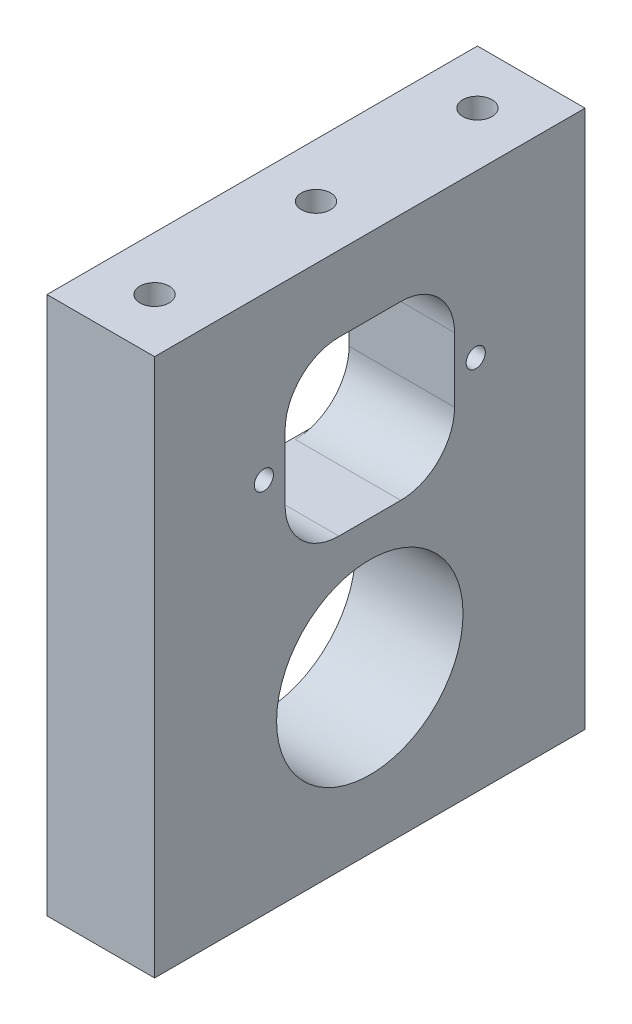
ISO-10303-21;
HEADER;
FILE_DESCRIPTION(('STEP AP214'),'2;1');
FILE_NAME('part.step','',(''),(''),'','','');
FILE_SCHEMA(('AUTOMOTIVE_DESIGN { 1 0 10303 214 1 1 1 1 }'));
ENDSEC;
DATA;
#1=APPLICATION_CONTEXT('core data for automotive mechanical design processes');
#2=APPLICATION_PROTOCOL_DEFINITION('international standard','automotive_design',2000,#1);
#3=PRODUCT_CONTEXT('',#1,'mechanical');
#4=PRODUCT('Part','Part','',(#3));
#5=PRODUCT_RELATED_PRODUCT_CATEGORY('part','',(#4));
#6=PRODUCT_DEFINITION_FORMATION('','',#4);
#7=PRODUCT_DEFINITION_CONTEXT('part definition',#1,'design');
#8=PRODUCT_DEFINITION('design','',#6,#7);
#9=PRODUCT_DEFINITION_SHAPE('','',#8);
#10=(LENGTH_UNIT() NAMED_UNIT(*) SI_UNIT(.MILLI.,.METRE.));
#11=(NAMED_UNIT(*) PLANE_ANGLE_UNIT() SI_UNIT($,.RADIAN.));
#12=(NAMED_UNIT(*) SI_UNIT($,.STERADIAN.) SOLID_ANGLE_UNIT());
#13=UNCERTAINTY_MEASURE_WITH_UNIT(LENGTH_MEASURE(1.E-05),#10,'distance_accuracy_value','');
#14=(GEOMETRIC_REPRESENTATION_CONTEXT(3) GLOBAL_UNCERTAINTY_ASSIGNED_CONTEXT((#13)) GLOBAL_UNIT_ASSIGNED_CONTEXT((#10,
#11,#12)) REPRESENTATION_CONTEXT('',''));
#15=CARTESIAN_POINT('',(0.,0.,0.));
#16=DIRECTION('',(0.,0.,1.));
#17=DIRECTION('',(1.,0.,0.));
#18=AXIS2_PLACEMENT_3D('',#15,#16,#17);
#19=CARTESIAN_POINT('',(0.,0.,0.));
#20=DIRECTION('',(-1.,0.,0.));
#21=DIRECTION('',(0.,0.,1.));
#22=AXIS2_PLACEMENT_3D('',#19,#20,#21);
#23=PLANE('',#22);
#24=CARTESIAN_POINT('',(0.,-12.7,0.));
#25=DIRECTION('',(1.,0.,0.));
#26=DIRECTION('',(0.,0.,-1.));
#27=AXIS2_PLACEMENT_3D('',#24,#25,#26);
#28=CIRCLE('',#27,11.);
#29=CARTESIAN_POINT('',(0.,-12.7,-11.));
#30=VERTEX_POINT('',#29);
#31=EDGE_CURVE('E327',#30,#30,#28,.T.);
#32=ORIENTED_EDGE('',*,*,#31,.T.);
#33=EDGE_LOOP('',(#32));
#34=FACE_BOUND('',#33,.T.);
#35=DIRECTION('',(0.,1.,0.));
#36=VECTOR('',#35,1.);
#37=CARTESIAN_POINT('',(0.,-31.75,-25.4));
#38=LINE('',#37,#36);
#39=CARTESIAN_POINT('',(0.,-31.75,-25.4));
#40=VERTEX_POINT('',#39);
#41=CARTESIAN_POINT('',(0.,31.75,-25.4));
#42=VERTEX_POINT('',#41);
#43=EDGE_CURVE('E330',#40,#42,#38,.T.);
#44=ORIENTED_EDGE('',*,*,#43,.F.);
#45=DIRECTION('',(0.,0.,-1.));
#46=VECTOR('',#45,1.);
#47=CARTESIAN_POINT('',(0.,-31.75,25.4));
#48=LINE('',#47,#46);
#49=CARTESIAN_POINT('',(0.,-31.75,25.4));
#50=VERTEX_POINT('',#49);
#51=EDGE_CURVE('E335',#50,#40,#48,.T.);
#52=ORIENTED_EDGE('',*,*,#51,.F.);
#53=DIRECTION('',(0.,-1.,0.));
#54=VECTOR('',#53,1.);
#55=CARTESIAN_POINT('',(0.,-31.75,25.4));
#56=LINE('',#55,#54);
#57=CARTESIAN_POINT('',(0.,31.75,25.4));
#58=VERTEX_POINT('',#57);
#59=EDGE_CURVE('E346',#58,#50,#56,.T.);
#60=ORIENTED_EDGE('',*,*,#59,.F.);
#61=DIRECTION('',(0.,0.,1.));
#62=VECTOR('',#61,1.);
#63=CARTESIAN_POINT('',(0.,31.75,25.4));
#64=LINE('',#63,#62);
#65=EDGE_CURVE('E344',#42,#58,#64,.T.);
#66=ORIENTED_EDGE('',*,*,#65,.F.);
#67=EDGE_LOOP('',(#44,#52,#60,#66));
#68=FACE_BOUND('',#67,.T.);
#69=DIRECTION('',(0.,0.,1.));
#70=VECTOR('',#69,1.);
#71=CARTESIAN_POINT('',(0.,22.86,3.65));
#72=LINE('',#71,#70);
#73=CARTESIAN_POINT('',(0.,22.86,-12.5));
#74=VERTEX_POINT('',#73);
#75=CARTESIAN_POINT('',(0.,22.86,12.5));
#76=VERTEX_POINT('',#75);
#77=EDGE_CURVE('E275',#74,#76,#72,.T.);
#78=ORIENTED_EDGE('',*,*,#77,.T.);
#79=CARTESIAN_POINT('',(0.,16.51,12.5));
#80=DIRECTION('',(1.,0.,0.));
#81=DIRECTION('',(0.,0.,1.));
#82=AXIS2_PLACEMENT_3D('',#79,#80,#81);
#83=CIRCLE('',#82,6.35);
#84=CARTESIAN_POINT('',(0.,16.51,18.85));
#85=VERTEX_POINT('',#84);
#86=EDGE_CURVE('E223',#76,#85,#83,.T.);
#87=ORIENTED_EDGE('',*,*,#86,.T.);
#88=DIRECTION('',(0.,-1.,0.));
#89=VECTOR('',#88,1.);
#90=CARTESIAN_POINT('',(0.,8.88999999999999,18.85));
#91=LINE('',#90,#89);
#92=CARTESIAN_POINT('',(0.,8.88999999999999,18.85));
#93=VERTEX_POINT('',#92);
#94=EDGE_CURVE('E226',#85,#93,#91,.T.);
#95=ORIENTED_EDGE('',*,*,#94,.T.);
#96=CARTESIAN_POINT('',(0.,8.88999999999999,12.5));
#97=DIRECTION('',(1.,0.,0.));
#98=DIRECTION('',(0.,0.,1.));
#99=AXIS2_PLACEMENT_3D('',#96,#97,#98);
#100=CIRCLE('',#99,6.35);
#101=CARTESIAN_POINT('',(0.,2.53999999999999,12.5));
#102=VERTEX_POINT('',#101);
#103=EDGE_CURVE('E229',#93,#102,#100,.T.);
#104=ORIENTED_EDGE('',*,*,#103,.T.);
#105=DIRECTION('',(0.,0.,-1.));
#106=VECTOR('',#105,1.);
#107=CARTESIAN_POINT('',(0.,2.53999999999999,3.65));
#108=LINE('',#107,#106);
#109=CARTESIAN_POINT('',(0.,2.53999999999999,-12.5));
#110=VERTEX_POINT('',#109);
#111=EDGE_CURVE('E277',#102,#110,#108,.T.);
#112=ORIENTED_EDGE('',*,*,#111,.T.);
#113=CARTESIAN_POINT('',(0.,8.88999999999999,-12.5));
#114=DIRECTION('',(1.,0.,0.));
#115=DIRECTION('',(0.,0.,-1.));
#116=AXIS2_PLACEMENT_3D('',#113,#114,#115);
#117=CIRCLE('',#116,6.35);
#118=CARTESIAN_POINT('',(0.,8.88999999999999,-18.85));
#119=VERTEX_POINT('',#118);
#120=EDGE_CURVE('E232',#110,#119,#117,.T.);
#121=ORIENTED_EDGE('',*,*,#120,.T.);
#122=DIRECTION('',(0.,1.,0.));
#123=VECTOR('',#122,1.);
#124=CARTESIAN_POINT('',(0.,8.88999999999999,-18.85));
#125=LINE('',#124,#123);
#126=CARTESIAN_POINT('',(0.,16.51,-18.85));
#127=VERTEX_POINT('',#126);
#128=EDGE_CURVE('E202',#119,#127,#125,.T.);
#129=ORIENTED_EDGE('',*,*,#128,.T.);
#130=CARTESIAN_POINT('',(0.,16.51,-12.5));
#131=DIRECTION('',(1.,0.,0.));
#132=DIRECTION('',(0.,0.,1.));
#133=AXIS2_PLACEMENT_3D('',#130,#131,#132);
#134=CIRCLE('',#133,6.35);
#135=EDGE_CURVE('E220',#127,#74,#134,.T.);
#136=ORIENTED_EDGE('',*,*,#135,.T.);
#137=EDGE_LOOP('',(#78,#87,#95,#104,#112,#121,#129,#136));
#138=FACE_BOUND('',#137,.T.);
#139=ADVANCED_FACE('F33',(#34,#68,#138),#23,.T.);
#140=CARTESIAN_POINT('',(12.7,12.7,-12.5));
#141=DIRECTION('',(1.,0.,0.));
#142=DIRECTION('',(0.,0.,-1.));
#143=AXIS2_PLACEMENT_3D('',#140,#141,#142);
#144=CYLINDRICAL_SURFACE('',#143,1.13029999999999);
#145=CARTESIAN_POINT('',(12.7,12.7,-12.5));
#146=DIRECTION('',(1.,0.,0.));
#147=DIRECTION('',(0.,0.,-1.));
#148=AXIS2_PLACEMENT_3D('',#145,#146,#147);
#149=CIRCLE('',#148,1.13029999999999);
#150=CARTESIAN_POINT('',(12.7,12.7,-13.6303));
#151=VERTEX_POINT('',#150);
#152=EDGE_CURVE('E321',#151,#151,#149,.T.);
#153=ORIENTED_EDGE('',*,*,#152,.T.);
#154=EDGE_LOOP('',(#153));
#155=FACE_BOUND('',#154,.T.);
#156=CARTESIAN_POINT('',(0.254000000000001,12.7,-12.5));
#157=DIRECTION('',(-1.,0.,0.));
#158=DIRECTION('',(0.,0.,1.));
#159=AXIS2_PLACEMENT_3D('',#156,#157,#158);
#160=CIRCLE('',#159,1.13029999999999);
#161=CARTESIAN_POINT('',(0.254000000000001,12.7,-11.3697));
#162=VERTEX_POINT('',#161);
#163=EDGE_CURVE('E271',#162,#162,#160,.F.);
#164=ORIENTED_EDGE('',*,*,#163,.F.);
#165=EDGE_LOOP('',(#164));
#166=FACE_BOUND('',#165,.T.);
#167=ADVANCED_FACE('F389',(#155,#166),#144,.F.);
#168=CARTESIAN_POINT('',(12.7,12.7,12.5));
#169=DIRECTION('',(1.,0.,0.));
#170=DIRECTION('',(0.,0.,-1.));
#171=AXIS2_PLACEMENT_3D('',#168,#169,#170);
#172=CYLINDRICAL_SURFACE('',#171,1.13029999999999);
#173=CARTESIAN_POINT('',(12.7,12.7,12.5));
#174=DIRECTION('',(1.,0.,0.));
#175=DIRECTION('',(0.,0.,-1.));
#176=AXIS2_PLACEMENT_3D('',#173,#174,#175);
#177=CIRCLE('',#176,1.13029999999999);
#178=CARTESIAN_POINT('',(12.7,12.7,11.3697));
#179=VERTEX_POINT('',#178);
#180=EDGE_CURVE('E305',#179,#179,#177,.T.);
#181=ORIENTED_EDGE('',*,*,#180,.T.);
#182=EDGE_LOOP('',(#181));
#183=FACE_BOUND('',#182,.T.);
#184=CARTESIAN_POINT('',(0.254000000000001,12.7,12.5));
#185=DIRECTION('',(-1.,0.,0.));
#186=DIRECTION('',(0.,0.,1.));
#187=AXIS2_PLACEMENT_3D('',#184,#185,#186);
#188=CIRCLE('',#187,1.13029999999999);
#189=CARTESIAN_POINT('',(0.254000000000001,12.7,13.6303));
#190=VERTEX_POINT('',#189);
#191=EDGE_CURVE('E268',#190,#190,#188,.F.);
#192=ORIENTED_EDGE('',*,*,#191,.F.);
#193=EDGE_LOOP('',(#192));
#194=FACE_BOUND('',#193,.T.);
#195=ADVANCED_FACE('F397',(#183,#194),#172,.F.);
#196=CARTESIAN_POINT('',(0.,16.51,-3.65000000000001));
#197=DIRECTION('',(1.,0.,0.));
#198=DIRECTION('',(0.,0.,-1.));
#199=AXIS2_PLACEMENT_3D('',#196,#197,#198);
#200=CYLINDRICAL_SURFACE('',#199,6.35);
#201=CARTESIAN_POINT('',(0.254,16.51,-3.65000000000001));
#202=DIRECTION('',(-1.,0.,0.));
#203=DIRECTION('',(0.,0.,1.));
#204=AXIS2_PLACEMENT_3D('',#201,#202,#203);
#205=CIRCLE('',#204,6.35);
#206=CARTESIAN_POINT('',(0.254,16.51,-10.));
#207=VERTEX_POINT('',#206);
#208=CARTESIAN_POINT('',(0.254,22.86,-3.65000000000001));
#209=VERTEX_POINT('',#208);
#210=EDGE_CURVE('E266',#207,#209,#205,.F.);
#211=ORIENTED_EDGE('',*,*,#210,.F.);
#212=DIRECTION('',(1.,0.,0.));
#213=VECTOR('',#212,1.);
#214=CARTESIAN_POINT('',(0.,16.51,-10.));
#215=LINE('',#214,#213);
#216=CARTESIAN_POINT('',(12.7,16.51,-10.));
#217=VERTEX_POINT('',#216);
#218=EDGE_CURVE('E303',#207,#217,#215,.T.);
#219=ORIENTED_EDGE('',*,*,#218,.T.);
#220=CARTESIAN_POINT('',(12.7,16.51,-3.65000000000001));
#221=DIRECTION('',(1.,0.,0.));
#222=DIRECTION('',(0.,0.,1.));
#223=AXIS2_PLACEMENT_3D('',#220,#221,#222);
#224=CIRCLE('',#223,6.35);
#225=CARTESIAN_POINT('',(12.7,22.86,-3.65000000000001));
#226=VERTEX_POINT('',#225);
#227=EDGE_CURVE('E274',#217,#226,#224,.T.);
#228=ORIENTED_EDGE('',*,*,#227,.T.);
#229=DIRECTION('',(1.,0.,0.));
#230=VECTOR('',#229,1.);
#231=CARTESIAN_POINT('',(0.,22.86,-3.65000000000001));
#232=LINE('',#231,#230);
#233=EDGE_CURVE('E280',#209,#226,#232,.T.);
#234=ORIENTED_EDGE('',*,*,#233,.F.);
#235=EDGE_LOOP('',(#211,#219,#228,#234));
#236=FACE_BOUND('',#235,.T.);
#237=ADVANCED_FACE('F462',(#236),#200,.F.);
#238=CARTESIAN_POINT('',(0.,8.88999999999999,-10.));
#239=DIRECTION('',(0.,0.,-1.));
#240=DIRECTION('',(-1.,0.,0.));
#241=AXIS2_PLACEMENT_3D('',#238,#239,#240);
#242=PLANE('',#241);
#243=DIRECTION('',(0.,1.,0.));
#244=VECTOR('',#243,1.);
#245=CARTESIAN_POINT('',(0.254,8.88999999999999,-10.));
#246=LINE('',#245,#244);
#247=CARTESIAN_POINT('',(0.254,8.88999999999999,-10.));
#248=VERTEX_POINT('',#247);
#249=EDGE_CURVE('E264',#248,#207,#246,.T.);
#250=ORIENTED_EDGE('',*,*,#249,.F.);
#251=DIRECTION('',(1.,0.,0.));
#252=VECTOR('',#251,1.);
#253=CARTESIAN_POINT('',(0.,8.88999999999999,-10.));
#254=LINE('',#253,#252);
#255=CARTESIAN_POINT('',(12.7,8.88999999999999,-10.));
#256=VERTEX_POINT('',#255);
#257=EDGE_CURVE('E306',#248,#256,#254,.T.);
#258=ORIENTED_EDGE('',*,*,#257,.T.);
#259=DIRECTION('',(0.,1.,0.));
#260=VECTOR('',#259,1.);
#261=CARTESIAN_POINT('',(12.7,8.88999999999999,-10.));
#262=LINE('',#261,#260);
#263=EDGE_CURVE('E278',#256,#217,#262,.T.);
#264=ORIENTED_EDGE('',*,*,#263,.T.);
#265=ORIENTED_EDGE('',*,*,#218,.F.);
#266=EDGE_LOOP('',(#250,#258,#264,#265));
#267=FACE_BOUND('',#266,.T.);
#268=ADVANCED_FACE('F468',(#267),#242,.F.);
#269=CARTESIAN_POINT('',(0.,8.88999999999999,-3.65000000000001));
#270=DIRECTION('',(1.,0.,0.));
#271=DIRECTION('',(0.,0.,-1.));
#272=AXIS2_PLACEMENT_3D('',#269,#270,#271);
#273=CYLINDRICAL_SURFACE('',#272,6.35);
#274=CARTESIAN_POINT('',(0.254,8.88999999999999,-3.65000000000001));
#275=DIRECTION('',(-1.,0.,0.));
#276=DIRECTION('',(0.,0.,1.));
#277=AXIS2_PLACEMENT_3D('',#274,#275,#276);
#278=CIRCLE('',#277,6.35);
#279=CARTESIAN_POINT('',(0.254,2.53999999999999,-3.65000000000001));
#280=VERTEX_POINT('',#279);
#281=EDGE_CURVE('E262',#280,#248,#278,.F.);
#282=ORIENTED_EDGE('',*,*,#281,.F.);
#283=DIRECTION('',(1.,0.,0.));
#284=VECTOR('',#283,1.);
#285=CARTESIAN_POINT('',(0.,2.53999999999999,-3.65000000000001));
#286=LINE('',#285,#284);
#287=CARTESIAN_POINT('',(12.7,2.53999999999999,-3.65000000000001));
#288=VERTEX_POINT('',#287);
#289=EDGE_CURVE('E308',#280,#288,#286,.T.);
#290=ORIENTED_EDGE('',*,*,#289,.T.);
#291=CARTESIAN_POINT('',(12.7,8.88999999999999,-3.65000000000001));
#292=DIRECTION('',(1.,0.,0.));
#293=DIRECTION('',(0.,0.,-1.));
#294=AXIS2_PLACEMENT_3D('',#291,#292,#293);
#295=CIRCLE('',#294,6.35);
#296=EDGE_CURVE('E298',#288,#256,#295,.T.);
#297=ORIENTED_EDGE('',*,*,#296,.T.);
#298=ORIENTED_EDGE('',*,*,#257,.F.);
#299=EDGE_LOOP('',(#282,#290,#297,#298));
#300=FACE_BOUND('',#299,.T.);
#301=ADVANCED_FACE('F482',(#300),#273,.F.);
#302=CARTESIAN_POINT('',(0.,8.88999999999999,3.65));
#303=DIRECTION('',(1.,0.,0.));
#304=DIRECTION('',(0.,0.,-1.));
#305=AXIS2_PLACEMENT_3D('',#302,#303,#304);
#306=CYLINDRICAL_SURFACE('',#305,6.35);
#307=CARTESIAN_POINT('',(0.254,8.88999999999999,3.65));
#308=DIRECTION('',(-1.,0.,0.));
#309=DIRECTION('',(0.,0.,1.));
#310=AXIS2_PLACEMENT_3D('',#307,#308,#309);
#311=CIRCLE('',#310,6.35);
#312=CARTESIAN_POINT('',(0.254,8.88999999999999,9.99999999999999));
#313=VERTEX_POINT('',#312);
#314=CARTESIAN_POINT('',(0.254,2.53999999999999,3.65));
#315=VERTEX_POINT('',#314);
#316=EDGE_CURVE('E260',#313,#315,#311,.F.);
#317=ORIENTED_EDGE('',*,*,#316,.F.);
#318=DIRECTION('',(1.,0.,0.));
#319=VECTOR('',#318,1.);
#320=CARTESIAN_POINT('',(0.,8.88999999999999,9.99999999999999));
#321=LINE('',#320,#319);
#322=CARTESIAN_POINT('',(12.7,8.88999999999999,9.99999999999999));
#323=VERTEX_POINT('',#322);
#324=EDGE_CURVE('E312',#313,#323,#321,.T.);
#325=ORIENTED_EDGE('',*,*,#324,.T.);
#326=CARTESIAN_POINT('',(12.7,8.88999999999999,3.65));
#327=DIRECTION('',(1.,0.,0.));
#328=DIRECTION('',(0.,0.,-1.));
#329=AXIS2_PLACEMENT_3D('',#326,#327,#328);
#330=CIRCLE('',#329,6.35);
#331=CARTESIAN_POINT('',(12.7,2.53999999999999,3.65));
#332=VERTEX_POINT('',#331);
#333=EDGE_CURVE('E292',#323,#332,#330,.T.);
#334=ORIENTED_EDGE('',*,*,#333,.T.);
#335=DIRECTION('',(1.,0.,0.));
#336=VECTOR('',#335,1.);
#337=CARTESIAN_POINT('',(0.,2.53999999999999,3.65));
#338=LINE('',#337,#336);
#339=EDGE_CURVE('E310',#315,#332,#338,.T.);
#340=ORIENTED_EDGE('',*,*,#339,.F.);
#341=EDGE_LOOP('',(#317,#325,#334,#340));
#342=FACE_BOUND('',#341,.T.);
#343=ADVANCED_FACE('F478',(#342),#306,.F.);
#344=CARTESIAN_POINT('',(0.,8.88999999999999,9.99999999999999));
#345=DIRECTION('',(0.,0.,1.));
#346=DIRECTION('',(0.,-1.,0.));
#347=AXIS2_PLACEMENT_3D('',#344,#345,#346);
#348=PLANE('',#347);
#349=DIRECTION('',(0.,-1.,0.));
#350=VECTOR('',#349,1.);
#351=CARTESIAN_POINT('',(0.254,8.88999999999999,9.99999999999999));
#352=LINE('',#351,#350);
#353=CARTESIAN_POINT('',(0.254,16.51,10.));
#354=VERTEX_POINT('',#353);
#355=EDGE_CURVE('E258',#354,#313,#352,.T.);
#356=ORIENTED_EDGE('',*,*,#355,.F.);
#357=DIRECTION('',(1.,0.,0.));
#358=VECTOR('',#357,1.);
#359=CARTESIAN_POINT('',(0.,16.51,10.));
#360=LINE('',#359,#358);
#361=CARTESIAN_POINT('',(12.7,16.51,10.));
#362=VERTEX_POINT('',#361);
#363=EDGE_CURVE('E314',#354,#362,#360,.T.);
#364=ORIENTED_EDGE('',*,*,#363,.T.);
#365=DIRECTION('',(0.,-1.,0.));
#366=VECTOR('',#365,1.);
#367=CARTESIAN_POINT('',(12.7,8.88999999999999,9.99999999999999));
#368=LINE('',#367,#366);
#369=EDGE_CURVE('E289',#362,#323,#368,.T.);
#370=ORIENTED_EDGE('',*,*,#369,.T.);
#371=ORIENTED_EDGE('',*,*,#324,.F.);
#372=EDGE_LOOP('',(#356,#364,#370,#371));
#373=FACE_BOUND('',#372,.T.);
#374=ADVANCED_FACE('F474',(#373),#348,.F.);
#375=CARTESIAN_POINT('',(0.,16.51,3.65));
#376=DIRECTION('',(1.,0.,0.));
#377=DIRECTION('',(0.,0.,-1.));
#378=AXIS2_PLACEMENT_3D('',#375,#376,#377);
#379=CYLINDRICAL_SURFACE('',#378,6.35);
#380=CARTESIAN_POINT('',(0.254,16.51,3.65));
#381=DIRECTION('',(-1.,0.,0.));
#382=DIRECTION('',(0.,0.,1.));
#383=AXIS2_PLACEMENT_3D('',#380,#381,#382);
#384=CIRCLE('',#383,6.35);
#385=CARTESIAN_POINT('',(0.254,22.86,3.65));
#386=VERTEX_POINT('',#385);
#387=EDGE_CURVE('E256',#386,#354,#384,.F.);
#388=ORIENTED_EDGE('',*,*,#387,.F.);
#389=DIRECTION('',(1.,0.,0.));
#390=VECTOR('',#389,1.);
#391=CARTESIAN_POINT('',(0.,22.86,3.65));
#392=LINE('',#391,#390);
#393=CARTESIAN_POINT('',(12.7,22.86,3.65));
#394=VERTEX_POINT('',#393);
#395=EDGE_CURVE('E316',#386,#394,#392,.T.);
#396=ORIENTED_EDGE('',*,*,#395,.T.);
#397=CARTESIAN_POINT('',(12.7,16.51,3.65));
#398=DIRECTION('',(1.,0.,0.));
#399=DIRECTION('',(0.,0.,-1.));
#400=AXIS2_PLACEMENT_3D('',#397,#398,#399);
#401=CIRCLE('',#400,6.35);
#402=EDGE_CURVE('E286',#394,#362,#401,.T.);
#403=ORIENTED_EDGE('',*,*,#402,.T.);
#404=ORIENTED_EDGE('',*,*,#363,.F.);
#405=EDGE_LOOP('',(#388,#396,#403,#404));
#406=FACE_BOUND('',#405,.T.);
#407=ADVANCED_FACE('F385',(#406),#379,.F.);
#408=CARTESIAN_POINT('',(12.7,-31.75,-25.4));
#409=DIRECTION('',(0.,0.,1.));
#410=DIRECTION('',(1.,0.,0.));
#411=AXIS2_PLACEMENT_3D('',#408,#409,#410);
#412=PLANE('',#411);
#413=ORIENTED_EDGE('',*,*,#43,.T.);
#414=DIRECTION('',(-1.,0.,0.));
#415=VECTOR('',#414,1.);
#416=CARTESIAN_POINT('',(12.7,31.75,-25.4));
#417=LINE('',#416,#415);
#418=CARTESIAN_POINT('',(12.7,31.75,-25.4));
#419=VERTEX_POINT('',#418);
#420=EDGE_CURVE('E11',#419,#42,#417,.T.);
#421=ORIENTED_EDGE('',*,*,#420,.F.);
#422=DIRECTION('',(0.,1.,0.));
#423=VECTOR('',#422,1.);
#424=CARTESIAN_POINT('',(12.7,-31.75,-25.4));
#425=LINE('',#424,#423);
#426=CARTESIAN_POINT('',(12.7,-31.75,-25.4));
#427=VERTEX_POINT('',#426);
#428=EDGE_CURVE('E331',#427,#419,#425,.T.);
#429=ORIENTED_EDGE('',*,*,#428,.F.);
#430=DIRECTION('',(-1.,0.,0.));
#431=VECTOR('',#430,1.);
#432=CARTESIAN_POINT('',(12.7,-31.75,-25.4));
#433=LINE('',#432,#431);
#434=EDGE_CURVE('E341',#427,#40,#433,.T.);
#435=ORIENTED_EDGE('',*,*,#434,.T.);
#436=EDGE_LOOP('',(#413,#421,#429,#435));
#437=FACE_BOUND('',#436,.T.);
#438=ADVANCED_FACE('F35',(#437),#412,.F.);
#439=CARTESIAN_POINT('',(12.7,31.75,25.4));
#440=DIRECTION('',(0.,-1.,0.));
#441=DIRECTION('',(0.,0.,-1.));
#442=AXIS2_PLACEMENT_3D('',#439,#440,#441);
#443=PLANE('',#442);
#444=CARTESIAN_POINT('',(6.35,31.75,-19.05));
#445=DIRECTION('',(0.,1.,0.));
#446=DIRECTION('',(0.,0.,1.));
#447=AXIS2_PLACEMENT_3D('',#444,#445,#446);
#448=CIRCLE('',#447,1.7272);
#449=CARTESIAN_POINT('',(6.35,31.75,-17.3228));
#450=VERTEX_POINT('',#449);
#451=EDGE_CURVE('E186',#450,#450,#448,.T.);
#452=ORIENTED_EDGE('',*,*,#451,.F.);
#453=EDGE_LOOP('',(#452));
#454=FACE_BOUND('',#453,.T.);
#455=CARTESIAN_POINT('',(6.35,31.75,19.05));
#456=DIRECTION('',(0.,1.,0.));
#457=DIRECTION('',(0.,0.,1.));
#458=AXIS2_PLACEMENT_3D('',#455,#456,#457);
#459=CIRCLE('',#458,1.7272);
#460=CARTESIAN_POINT('',(6.35,31.75,20.7772));
#461=VERTEX_POINT('',#460);
#462=EDGE_CURVE('E185',#461,#461,#459,.T.);
#463=ORIENTED_EDGE('',*,*,#462,.F.);
#464=EDGE_LOOP('',(#463));
#465=FACE_BOUND('',#464,.T.);
#466=CARTESIAN_POINT('',(6.35,31.75,0.));
#467=DIRECTION('',(0.,1.,0.));
#468=DIRECTION('',(0.,0.,1.));
#469=AXIS2_PLACEMENT_3D('',#466,#467,#468);
#470=CIRCLE('',#469,1.7272);
#471=CARTESIAN_POINT('',(6.35,31.75,1.7272));
#472=VERTEX_POINT('',#471);
#473=EDGE_CURVE('E196',#472,#472,#470,.T.);
#474=ORIENTED_EDGE('',*,*,#473,.F.);
#475=EDGE_LOOP('',(#474));
#476=FACE_BOUND('',#475,.T.);
#477=ORIENTED_EDGE('',*,*,#65,.T.);
#478=DIRECTION('',(-1.,0.,0.));
#479=VECTOR('',#478,1.);
#480=CARTESIAN_POINT('',(12.7,31.75,25.4));
#481=LINE('',#480,#479);
#482=CARTESIAN_POINT('',(12.7,31.75,25.4));
#483=VERTEX_POINT('',#482);
#484=EDGE_CURVE('E42',#483,#58,#481,.T.);
#485=ORIENTED_EDGE('',*,*,#484,.F.);
#486=DIRECTION('',(0.,0.,1.));
#487=VECTOR('',#486,1.);
#488=CARTESIAN_POINT('',(12.7,31.75,25.4));
#489=LINE('',#488,#487);
#490=EDGE_CURVE('E334',#419,#483,#489,.T.);
#491=ORIENTED_EDGE('',*,*,#490,.F.);
#492=ORIENTED_EDGE('',*,*,#420,.T.);
#493=EDGE_LOOP('',(#477,#485,#491,#492));
#494=FACE_BOUND('',#493,.T.);
#495=ADVANCED_FACE('F375',(#454,#465,#476,#494),#443,.F.);
#496=CARTESIAN_POINT('',(12.7,-31.75,25.4));
#497=DIRECTION('',(0.,0.,-1.));
#498=DIRECTION('',(-1.,0.,0.));
#499=AXIS2_PLACEMENT_3D('',#496,#497,#498);
#500=PLANE('',#499);
#501=ORIENTED_EDGE('',*,*,#59,.T.);
#502=DIRECTION('',(-1.,0.,0.));
#503=VECTOR('',#502,1.);
#504=CARTESIAN_POINT('',(12.7,-31.75,25.4));
#505=LINE('',#504,#503);
#506=CARTESIAN_POINT('',(12.7,-31.75,25.4));
#507=VERTEX_POINT('',#506);
#508=EDGE_CURVE('E351',#507,#50,#505,.T.);
#509=ORIENTED_EDGE('',*,*,#508,.F.);
#510=DIRECTION('',(0.,-1.,0.));
#511=VECTOR('',#510,1.);
#512=CARTESIAN_POINT('',(12.7,-31.75,25.4));
#513=LINE('',#512,#511);
#514=EDGE_CURVE('E337',#483,#507,#513,.T.);
#515=ORIENTED_EDGE('',*,*,#514,.F.);
#516=ORIENTED_EDGE('',*,*,#484,.T.);
#517=EDGE_LOOP('',(#501,#509,#515,#516));
#518=FACE_BOUND('',#517,.T.);
#519=ADVANCED_FACE('F359',(#518),#500,.F.);
#520=CARTESIAN_POINT('',(12.7,-31.75,25.4));
#521=DIRECTION('',(0.,1.,0.));
#522=DIRECTION('',(0.,0.,1.));
#523=AXIS2_PLACEMENT_3D('',#520,#521,#522);
#524=PLANE('',#523);
#525=ORIENTED_EDGE('',*,*,#51,.T.);
#526=ORIENTED_EDGE('',*,*,#434,.F.);
#527=DIRECTION('',(0.,0.,-1.));
#528=VECTOR('',#527,1.);
#529=CARTESIAN_POINT('',(12.7,-31.75,25.4));
#530=LINE('',#529,#528);
#531=EDGE_CURVE('E339',#507,#427,#530,.T.);
#532=ORIENTED_EDGE('',*,*,#531,.F.);
#533=ORIENTED_EDGE('',*,*,#508,.T.);
#534=EDGE_LOOP('',(#525,#526,#532,#533));
#535=FACE_BOUND('',#534,.T.);
#536=ADVANCED_FACE('F368',(#535),#524,.F.);
#537=CARTESIAN_POINT('',(12.7,0.,0.));
#538=DIRECTION('',(-1.,0.,0.));
#539=DIRECTION('',(0.,0.,1.));
#540=AXIS2_PLACEMENT_3D('',#537,#538,#539);
#541=PLANE('',#540);
#542=DIRECTION('',(0.,0.,1.));
#543=VECTOR('',#542,1.);
#544=CARTESIAN_POINT('',(12.7,22.86,3.65));
#545=LINE('',#544,#543);
#546=EDGE_CURVE('E283',#226,#394,#545,.T.);
#547=ORIENTED_EDGE('',*,*,#546,.F.);
#548=ORIENTED_EDGE('',*,*,#227,.F.);
#549=ORIENTED_EDGE('',*,*,#263,.F.);
#550=ORIENTED_EDGE('',*,*,#296,.F.);
#551=DIRECTION('',(0.,0.,-1.));
#552=VECTOR('',#551,1.);
#553=CARTESIAN_POINT('',(12.7,2.53999999999999,3.65));
#554=LINE('',#553,#552);
#555=EDGE_CURVE('E295',#332,#288,#554,.T.);
#556=ORIENTED_EDGE('',*,*,#555,.F.);
#557=ORIENTED_EDGE('',*,*,#333,.F.);
#558=ORIENTED_EDGE('',*,*,#369,.F.);
#559=ORIENTED_EDGE('',*,*,#402,.F.);
#560=EDGE_LOOP('',(#547,#548,#549,#550,#556,#557,#558,#559));
#561=FACE_BOUND('',#560,.T.);
#562=ORIENTED_EDGE('',*,*,#180,.F.);
#563=EDGE_LOOP('',(#562));
#564=FACE_BOUND('',#563,.T.);
#565=ORIENTED_EDGE('',*,*,#152,.F.);
#566=EDGE_LOOP('',(#565));
#567=FACE_BOUND('',#566,.T.);
#568=CARTESIAN_POINT('',(12.7,-12.7,0.));
#569=DIRECTION('',(1.,0.,0.));
#570=DIRECTION('',(0.,0.,-1.));
#571=AXIS2_PLACEMENT_3D('',#568,#569,#570);
#572=CIRCLE('',#571,11.);
#573=CARTESIAN_POINT('',(12.7,-12.7,-11.));
#574=VERTEX_POINT('',#573);
#575=EDGE_CURVE('E324',#574,#574,#572,.T.);
#576=ORIENTED_EDGE('',*,*,#575,.F.);
#577=EDGE_LOOP('',(#576));
#578=FACE_BOUND('',#577,.T.);
#579=ORIENTED_EDGE('',*,*,#428,.T.);
#580=ORIENTED_EDGE('',*,*,#490,.T.);
#581=ORIENTED_EDGE('',*,*,#514,.T.);
#582=ORIENTED_EDGE('',*,*,#531,.T.);
#583=EDGE_LOOP('',(#579,#580,#581,#582));
#584=FACE_BOUND('',#583,.T.);
#585=ADVANCED_FACE('F374',(#561,#564,#567,#578,#584),#541,.F.);
#586=CARTESIAN_POINT('',(12.7,-12.7,0.));
#587=DIRECTION('',(1.,0.,0.));
#588=DIRECTION('',(0.,0.,-1.));
#589=AXIS2_PLACEMENT_3D('',#586,#587,#588);
#590=CYLINDRICAL_SURFACE('',#589,11.);
#591=ORIENTED_EDGE('',*,*,#31,.F.);
#592=EDGE_LOOP('',(#591));
#593=FACE_BOUND('',#592,.T.);
#594=ORIENTED_EDGE('',*,*,#575,.T.);
#595=EDGE_LOOP('',(#594));
#596=FACE_BOUND('',#595,.T.);
#597=ADVANCED_FACE('F407',(#593,#596),#590,.F.);
#598=CARTESIAN_POINT('',(0.,2.53999999999999,3.65));
#599=DIRECTION('',(0.,-1.,0.));
#600=DIRECTION('',(0.,0.,-1.));
#601=AXIS2_PLACEMENT_3D('',#598,#599,#600);
#602=PLANE('',#601);
#603=ORIENTED_EDGE('',*,*,#111,.F.);
#604=DIRECTION('',(-1.,0.,0.));
#605=VECTOR('',#604,1.);
#606=CARTESIAN_POINT('',(0.254,2.53999999999999,12.5));
#607=LINE('',#606,#605);
#608=CARTESIAN_POINT('',(0.254,2.53999999999999,12.5));
#609=VERTEX_POINT('',#608);
#610=EDGE_CURVE('E243',#609,#102,#607,.T.);
#611=ORIENTED_EDGE('',*,*,#610,.F.);
#612=DIRECTION('',(0.,0.,-1.));
#613=VECTOR('',#612,1.);
#614=CARTESIAN_POINT('',(0.254,2.53999999999999,12.5));
#615=LINE('',#614,#613);
#616=EDGE_CURVE('E212',#609,#315,#615,.T.);
#617=ORIENTED_EDGE('',*,*,#616,.T.);
#618=ORIENTED_EDGE('',*,*,#339,.T.);
#619=ORIENTED_EDGE('',*,*,#555,.T.);
#620=ORIENTED_EDGE('',*,*,#289,.F.);
#621=CARTESIAN_POINT('',(0.254,2.53999999999999,-12.5));
#622=VERTEX_POINT('',#621);
#623=EDGE_CURVE('E49',#280,#622,#615,.T.);
#624=ORIENTED_EDGE('',*,*,#623,.T.);
#625=DIRECTION('',(-1.,0.,0.));
#626=VECTOR('',#625,1.);
#627=CARTESIAN_POINT('',(0.254,2.53999999999999,-12.5));
#628=LINE('',#627,#626);
#629=EDGE_CURVE('E240',#622,#110,#628,.T.);
#630=ORIENTED_EDGE('',*,*,#629,.T.);
#631=EDGE_LOOP('',(#603,#611,#617,#618,#619,#620,#624,#630));
#632=FACE_BOUND('',#631,.T.);
#633=ADVANCED_FACE('F412',(#632),#602,.F.);
#634=CARTESIAN_POINT('',(0.,22.86,3.65));
#635=DIRECTION('',(0.,1.,0.));
#636=DIRECTION('',(0.,0.,1.));
#637=AXIS2_PLACEMENT_3D('',#634,#635,#636);
#638=PLANE('',#637);
#639=CARTESIAN_POINT('',(6.35,22.86,0.));
#640=DIRECTION('',(0.,1.,0.));
#641=DIRECTION('',(0.,0.,1.));
#642=AXIS2_PLACEMENT_3D('',#639,#640,#641);
#643=CIRCLE('',#642,1.7272);
#644=CARTESIAN_POINT('',(6.35,22.86,1.7272));
#645=VERTEX_POINT('',#644);
#646=EDGE_CURVE('E37',#645,#645,#643,.T.);
#647=ORIENTED_EDGE('',*,*,#646,.T.);
#648=EDGE_LOOP('',(#647));
#649=FACE_BOUND('',#648,.T.);
#650=ORIENTED_EDGE('',*,*,#77,.F.);
#651=DIRECTION('',(-1.,0.,0.));
#652=VECTOR('',#651,1.);
#653=CARTESIAN_POINT('',(0.254,22.86,-12.5));
#654=LINE('',#653,#652);
#655=CARTESIAN_POINT('',(0.254,22.86,-12.5));
#656=VERTEX_POINT('',#655);
#657=EDGE_CURVE('E253',#656,#74,#654,.T.);
#658=ORIENTED_EDGE('',*,*,#657,.F.);
#659=DIRECTION('',(0.,0.,1.));
#660=VECTOR('',#659,1.);
#661=CARTESIAN_POINT('',(0.254,22.86,12.5));
#662=LINE('',#661,#660);
#663=EDGE_CURVE('E203',#656,#209,#662,.T.);
#664=ORIENTED_EDGE('',*,*,#663,.T.);
#665=ORIENTED_EDGE('',*,*,#233,.T.);
#666=ORIENTED_EDGE('',*,*,#546,.T.);
#667=ORIENTED_EDGE('',*,*,#395,.F.);
#668=CARTESIAN_POINT('',(0.254,22.86,12.5));
#669=VERTEX_POINT('',#668);
#670=EDGE_CURVE('E57',#386,#669,#662,.T.);
#671=ORIENTED_EDGE('',*,*,#670,.T.);
#672=DIRECTION('',(-1.,0.,0.));
#673=VECTOR('',#672,1.);
#674=CARTESIAN_POINT('',(0.254,22.86,12.5));
#675=LINE('',#674,#673);
#676=EDGE_CURVE('E250',#669,#76,#675,.T.);
#677=ORIENTED_EDGE('',*,*,#676,.T.);
#678=EDGE_LOOP('',(#650,#658,#664,#665,#666,#667,#671,#677));
#679=FACE_BOUND('',#678,.T.);
#680=ADVANCED_FACE('F447',(#649,#679),#638,.F.);
#681=CARTESIAN_POINT('',(0.254,16.51,-12.5));
#682=DIRECTION('',(-1.,0.,0.));
#683=DIRECTION('',(0.,0.,1.));
#684=AXIS2_PLACEMENT_3D('',#681,#682,#683);
#685=PLANE('',#684);
#686=ORIENTED_EDGE('',*,*,#316,.T.);
#687=ORIENTED_EDGE('',*,*,#616,.F.);
#688=CARTESIAN_POINT('',(0.254,8.88999999999999,12.5));
#689=DIRECTION('',(1.,0.,0.));
#690=DIRECTION('',(0.,0.,1.));
#691=AXIS2_PLACEMENT_3D('',#688,#689,#690);
#692=CIRCLE('',#691,6.35);
#693=CARTESIAN_POINT('',(0.254,8.88999999999999,18.85));
#694=VERTEX_POINT('',#693);
#695=EDGE_CURVE('E210',#694,#609,#692,.T.);
#696=ORIENTED_EDGE('',*,*,#695,.F.);
#697=DIRECTION('',(0.,-1.,0.));
#698=VECTOR('',#697,1.);
#699=CARTESIAN_POINT('',(0.254,8.88999999999999,18.85));
#700=LINE('',#699,#698);
#701=CARTESIAN_POINT('',(0.254,16.51,18.85));
#702=VERTEX_POINT('',#701);
#703=EDGE_CURVE('E208',#702,#694,#700,.T.);
#704=ORIENTED_EDGE('',*,*,#703,.F.);
#705=CARTESIAN_POINT('',(0.254,16.51,12.5));
#706=DIRECTION('',(1.,0.,0.));
#707=DIRECTION('',(0.,0.,1.));
#708=AXIS2_PLACEMENT_3D('',#705,#706,#707);
#709=CIRCLE('',#708,6.35);
#710=EDGE_CURVE('E206',#669,#702,#709,.T.);
#711=ORIENTED_EDGE('',*,*,#710,.F.);
#712=ORIENTED_EDGE('',*,*,#670,.F.);
#713=ORIENTED_EDGE('',*,*,#387,.T.);
#714=ORIENTED_EDGE('',*,*,#355,.T.);
#715=EDGE_LOOP('',(#686,#687,#696,#704,#711,#712,#713,#714));
#716=FACE_BOUND('',#715,.T.);
#717=ORIENTED_EDGE('',*,*,#191,.T.);
#718=EDGE_LOOP('',(#717));
#719=FACE_BOUND('',#718,.T.);
#720=ADVANCED_FACE('F432',(#716,#719),#685,.T.);
#721=CARTESIAN_POINT('',(0.254,8.88999999999999,12.5));
#722=DIRECTION('',(-1.,0.,0.));
#723=DIRECTION('',(0.,0.,1.));
#724=AXIS2_PLACEMENT_3D('',#721,#722,#723);
#725=CYLINDRICAL_SURFACE('',#724,6.35);
#726=ORIENTED_EDGE('',*,*,#103,.F.);
#727=DIRECTION('',(-1.,0.,0.));
#728=VECTOR('',#727,1.);
#729=CARTESIAN_POINT('',(0.254,8.88999999999999,18.85));
#730=LINE('',#729,#728);
#731=EDGE_CURVE('E246',#694,#93,#730,.T.);
#732=ORIENTED_EDGE('',*,*,#731,.F.);
#733=ORIENTED_EDGE('',*,*,#695,.T.);
#734=ORIENTED_EDGE('',*,*,#610,.T.);
#735=EDGE_LOOP('',(#726,#732,#733,#734));
#736=FACE_BOUND('',#735,.T.);
#737=ADVANCED_FACE('F446',(#736),#725,.F.);
#738=CARTESIAN_POINT('',(0.254,8.88999999999999,18.85));
#739=DIRECTION('',(0.,0.,-1.));
#740=DIRECTION('',(-1.,0.,0.));
#741=AXIS2_PLACEMENT_3D('',#738,#739,#740);
#742=PLANE('',#741);
#743=ORIENTED_EDGE('',*,*,#94,.F.);
#744=DIRECTION('',(-1.,0.,0.));
#745=VECTOR('',#744,1.);
#746=CARTESIAN_POINT('',(0.254,16.51,18.85));
#747=LINE('',#746,#745);
#748=EDGE_CURVE('E248',#702,#85,#747,.T.);
#749=ORIENTED_EDGE('',*,*,#748,.F.);
#750=ORIENTED_EDGE('',*,*,#703,.T.);
#751=ORIENTED_EDGE('',*,*,#731,.T.);
#752=EDGE_LOOP('',(#743,#749,#750,#751));
#753=FACE_BOUND('',#752,.T.);
#754=ADVANCED_FACE('F440',(#753),#742,.T.);
#755=CARTESIAN_POINT('',(0.254,16.51,12.5));
#756=DIRECTION('',(-1.,0.,0.));
#757=DIRECTION('',(0.,0.,1.));
#758=AXIS2_PLACEMENT_3D('',#755,#756,#757);
#759=CYLINDRICAL_SURFACE('',#758,6.35);
#760=ORIENTED_EDGE('',*,*,#86,.F.);
#761=ORIENTED_EDGE('',*,*,#676,.F.);
#762=ORIENTED_EDGE('',*,*,#710,.T.);
#763=ORIENTED_EDGE('',*,*,#748,.T.);
#764=EDGE_LOOP('',(#760,#761,#762,#763));
#765=FACE_BOUND('',#764,.T.);
#766=ADVANCED_FACE('F430',(#765),#759,.F.);
#767=ORIENTED_EDGE('',*,*,#210,.T.);
#768=ORIENTED_EDGE('',*,*,#663,.F.);
#769=CARTESIAN_POINT('',(0.254,16.51,-12.5));
#770=DIRECTION('',(1.,0.,0.));
#771=DIRECTION('',(0.,0.,1.));
#772=AXIS2_PLACEMENT_3D('',#769,#770,#771);
#773=CIRCLE('',#772,6.35);
#774=CARTESIAN_POINT('',(0.254,16.51,-18.85));
#775=VERTEX_POINT('',#774);
#776=EDGE_CURVE('E199',#775,#656,#773,.T.);
#777=ORIENTED_EDGE('',*,*,#776,.F.);
#778=DIRECTION('',(0.,1.,0.));
#779=VECTOR('',#778,1.);
#780=CARTESIAN_POINT('',(0.254,8.88999999999999,-18.85));
#781=LINE('',#780,#779);
#782=CARTESIAN_POINT('',(0.254,8.88999999999999,-18.85));
#783=VERTEX_POINT('',#782);
#784=EDGE_CURVE('E217',#783,#775,#781,.T.);
#785=ORIENTED_EDGE('',*,*,#784,.F.);
#786=CARTESIAN_POINT('',(0.254,8.88999999999999,-12.5));
#787=DIRECTION('',(1.,0.,0.));
#788=DIRECTION('',(0.,0.,-1.));
#789=AXIS2_PLACEMENT_3D('',#786,#787,#788);
#790=CIRCLE('',#789,6.35);
#791=EDGE_CURVE('E215',#622,#783,#790,.T.);
#792=ORIENTED_EDGE('',*,*,#791,.F.);
#793=ORIENTED_EDGE('',*,*,#623,.F.);
#794=ORIENTED_EDGE('',*,*,#281,.T.);
#795=ORIENTED_EDGE('',*,*,#249,.T.);
#796=EDGE_LOOP('',(#767,#768,#777,#785,#792,#793,#794,#795));
#797=FACE_BOUND('',#796,.T.);
#798=ORIENTED_EDGE('',*,*,#163,.T.);
#799=EDGE_LOOP('',(#798));
#800=FACE_BOUND('',#799,.T.);
#801=ADVANCED_FACE('F427',(#797,#800),#685,.T.);
#802=CARTESIAN_POINT('',(0.254,16.51,-12.5));
#803=DIRECTION('',(-1.,0.,0.));
#804=DIRECTION('',(0.,0.,1.));
#805=AXIS2_PLACEMENT_3D('',#802,#803,#804);
#806=CYLINDRICAL_SURFACE('',#805,6.35);
#807=ORIENTED_EDGE('',*,*,#135,.F.);
#808=DIRECTION('',(-1.,0.,0.));
#809=VECTOR('',#808,1.);
#810=CARTESIAN_POINT('',(0.254,16.51,-18.85));
#811=LINE('',#810,#809);
#812=EDGE_CURVE('E219',#775,#127,#811,.T.);
#813=ORIENTED_EDGE('',*,*,#812,.F.);
#814=ORIENTED_EDGE('',*,*,#776,.T.);
#815=ORIENTED_EDGE('',*,*,#657,.T.);
#816=EDGE_LOOP('',(#807,#813,#814,#815));
#817=FACE_BOUND('',#816,.T.);
#818=ADVANCED_FACE('F429',(#817),#806,.F.);
#819=CARTESIAN_POINT('',(0.254,8.88999999999999,-12.5));
#820=DIRECTION('',(-1.,0.,0.));
#821=DIRECTION('',(0.,0.,1.));
#822=AXIS2_PLACEMENT_3D('',#819,#820,#821);
#823=CYLINDRICAL_SURFACE('',#822,6.35);
#824=ORIENTED_EDGE('',*,*,#120,.F.);
#825=ORIENTED_EDGE('',*,*,#629,.F.);
#826=ORIENTED_EDGE('',*,*,#791,.T.);
#827=DIRECTION('',(-1.,0.,0.));
#828=VECTOR('',#827,1.);
#829=CARTESIAN_POINT('',(0.254,8.88999999999999,-18.85));
#830=LINE('',#829,#828);
#831=EDGE_CURVE('E238',#783,#119,#830,.T.);
#832=ORIENTED_EDGE('',*,*,#831,.T.);
#833=EDGE_LOOP('',(#824,#825,#826,#832));
#834=FACE_BOUND('',#833,.T.);
#835=ADVANCED_FACE('F437',(#834),#823,.F.);
#836=CARTESIAN_POINT('',(0.254,8.88999999999999,-18.85));
#837=DIRECTION('',(0.,0.,1.));
#838=DIRECTION('',(0.,-1.,0.));
#839=AXIS2_PLACEMENT_3D('',#836,#837,#838);
#840=PLANE('',#839);
#841=ORIENTED_EDGE('',*,*,#128,.F.);
#842=ORIENTED_EDGE('',*,*,#831,.F.);
#843=ORIENTED_EDGE('',*,*,#784,.T.);
#844=ORIENTED_EDGE('',*,*,#812,.T.);
#845=EDGE_LOOP('',(#841,#842,#843,#844));
#846=FACE_BOUND('',#845,.T.);
#847=ADVANCED_FACE('F497',(#846),#840,.T.);
#848=CARTESIAN_POINT('',(6.35,31.75,0.));
#849=DIRECTION('',(0.,1.,0.));
#850=DIRECTION('',(0.,0.,1.));
#851=AXIS2_PLACEMENT_3D('',#848,#849,#850);
#852=CYLINDRICAL_SURFACE('',#851,1.7272);
#853=ORIENTED_EDGE('',*,*,#473,.T.);
#854=EDGE_LOOP('',(#853));
#855=FACE_BOUND('',#854,.T.);
#856=ORIENTED_EDGE('',*,*,#646,.F.);
#857=EDGE_LOOP('',(#856));
#858=FACE_BOUND('',#857,.T.);
#859=ADVANCED_FACE('F500',(#855,#858),#852,.F.);
#860=CARTESIAN_POINT('',(6.35,21.082,19.05));
#861=DIRECTION('',(0.,1.,0.));
#862=DIRECTION('',(0.,0.,1.));
#863=AXIS2_PLACEMENT_3D('',#860,#861,#862);
#864=CONICAL_SURFACE('',#863,1.7272,1.02974425867665);
#865=CARTESIAN_POINT('',(6.35,20.0441935388156,19.05));
#866=VERTEX_POINT('',#865);
#867=VERTEX_LOOP('',#866);
#868=FACE_BOUND('',#867,.T.);
#869=CARTESIAN_POINT('',(6.35,21.082,19.05));
#870=DIRECTION('',(0.,1.,0.));
#871=DIRECTION('',(0.,0.,1.));
#872=AXIS2_PLACEMENT_3D('',#869,#870,#871);
#873=CIRCLE('',#872,1.7272);
#874=CARTESIAN_POINT('',(6.35,21.082,20.7772));
#875=VERTEX_POINT('',#874);
#876=EDGE_CURVE('E189',#875,#875,#873,.T.);
#877=ORIENTED_EDGE('',*,*,#876,.T.);
#878=EDGE_LOOP('',(#877));
#879=FACE_BOUND('',#878,.T.);
#880=ADVANCED_FACE('F504',(#868,#879),#864,.F.);
#881=CARTESIAN_POINT('',(6.35,31.75,19.05));
#882=DIRECTION('',(0.,1.,0.));
#883=DIRECTION('',(0.,0.,1.));
#884=AXIS2_PLACEMENT_3D('',#881,#882,#883);
#885=CYLINDRICAL_SURFACE('',#884,1.7272);
#886=ORIENTED_EDGE('',*,*,#876,.F.);
#887=EDGE_LOOP('',(#886));
#888=FACE_BOUND('',#887,.T.);
#889=ORIENTED_EDGE('',*,*,#462,.T.);
#890=EDGE_LOOP('',(#889));
#891=FACE_BOUND('',#890,.T.);
#892=ADVANCED_FACE('F179',(#888,#891),#885,.F.);
#893=CARTESIAN_POINT('',(6.35,21.082,-19.05));
#894=DIRECTION('',(0.,1.,0.));
#895=DIRECTION('',(0.,0.,1.));
#896=AXIS2_PLACEMENT_3D('',#893,#894,#895);
#897=CONICAL_SURFACE('',#896,1.7272,1.02974425867665);
#898=CARTESIAN_POINT('',(6.35,20.0441935388156,-19.05));
#899=VERTEX_POINT('',#898);
#900=VERTEX_LOOP('',#899);
#901=FACE_BOUND('',#900,.T.);
#902=CARTESIAN_POINT('',(6.35,21.082,-19.05));
#903=DIRECTION('',(0.,1.,0.));
#904=DIRECTION('',(0.,0.,1.));
#905=AXIS2_PLACEMENT_3D('',#902,#903,#904);
#906=CIRCLE('',#905,1.7272);
#907=CARTESIAN_POINT('',(6.35,21.082,-17.3228));
#908=VERTEX_POINT('',#907);
#909=EDGE_CURVE('E183',#908,#908,#906,.T.);
#910=ORIENTED_EDGE('',*,*,#909,.T.);
#911=EDGE_LOOP('',(#910));
#912=FACE_BOUND('',#911,.T.);
#913=ADVANCED_FACE('F175',(#901,#912),#897,.F.);
#914=CARTESIAN_POINT('',(6.35,31.75,-19.05));
#915=DIRECTION('',(0.,1.,0.));
#916=DIRECTION('',(0.,0.,1.));
#917=AXIS2_PLACEMENT_3D('',#914,#915,#916);
#918=CYLINDRICAL_SURFACE('',#917,1.7272);
#919=ORIENTED_EDGE('',*,*,#909,.F.);
#920=EDGE_LOOP('',(#919));
#921=FACE_BOUND('',#920,.T.);
#922=ORIENTED_EDGE('',*,*,#451,.T.);
#923=EDGE_LOOP('',(#922));
#924=FACE_BOUND('',#923,.T.);
#925=ADVANCED_FACE('F178',(#921,#924),#918,.F.);
#926=CLOSED_SHELL('',(#139,#167,#195,#237,#268,#301,#343,#374,#407,#438,#495,#519,#536,#585,
#597,#633,#680,#720,#737,#754,#766,#801,#818,#835,#847,#859,#880,#892,#913,#925));
#927=MANIFOLD_SOLID_BREP('B2',#926);
#928=ADVANCED_BREP_SHAPE_REPRESENTATION('',(#18,#927),#14);
#929=SHAPE_DEFINITION_REPRESENTATION(#9,#928);
ENDSEC;
END-ISO-10303-21;
